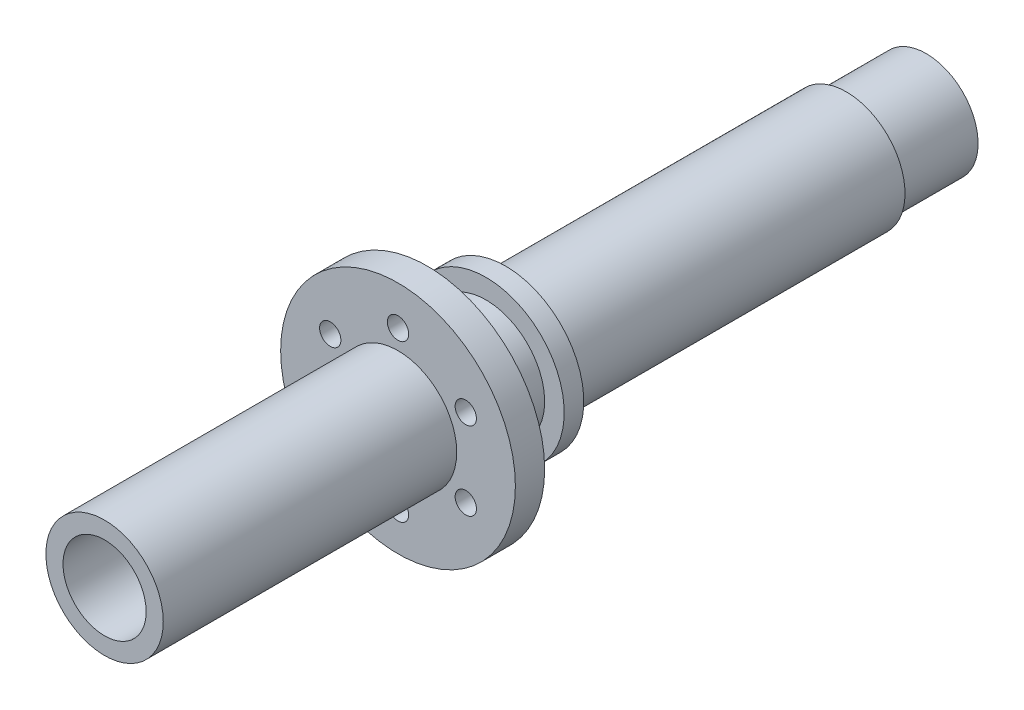
ISO-10303-21;
HEADER;
FILE_DESCRIPTION(('STEP AP214'),'2;1');
FILE_NAME('part.step','',(''),(''),'','','');
FILE_SCHEMA(('AUTOMOTIVE_DESIGN { 1 0 10303 214 1 1 1 1 }'));
ENDSEC;
DATA;
#1=APPLICATION_CONTEXT('core data for automotive mechanical design processes');
#2=APPLICATION_PROTOCOL_DEFINITION('international standard','automotive_design',2000,#1);
#3=PRODUCT_CONTEXT('',#1,'mechanical');
#4=PRODUCT('Part','Part','',(#3));
#5=PRODUCT_RELATED_PRODUCT_CATEGORY('part','',(#4));
#6=PRODUCT_DEFINITION_FORMATION('','',#4);
#7=PRODUCT_DEFINITION_CONTEXT('part definition',#1,'design');
#8=PRODUCT_DEFINITION('design','',#6,#7);
#9=PRODUCT_DEFINITION_SHAPE('','',#8);
#10=(LENGTH_UNIT() NAMED_UNIT(*) SI_UNIT(.MILLI.,.METRE.));
#11=(NAMED_UNIT(*) PLANE_ANGLE_UNIT() SI_UNIT($,.RADIAN.));
#12=(NAMED_UNIT(*) SI_UNIT($,.STERADIAN.) SOLID_ANGLE_UNIT());
#13=UNCERTAINTY_MEASURE_WITH_UNIT(LENGTH_MEASURE(1.E-05),#10,'distance_accuracy_value','');
#14=(GEOMETRIC_REPRESENTATION_CONTEXT(3) GLOBAL_UNCERTAINTY_ASSIGNED_CONTEXT((#13)) GLOBAL_UNIT_ASSIGNED_CONTEXT((#10,
#11,#12)) REPRESENTATION_CONTEXT('',''));
#15=CARTESIAN_POINT('',(0.,0.,0.));
#16=DIRECTION('',(0.,0.,1.));
#17=DIRECTION('',(1.,0.,0.));
#18=AXIS2_PLACEMENT_3D('',#15,#16,#17);
#19=CARTESIAN_POINT('',(0.,0.,85.7123));
#20=DIRECTION('',(0.,0.,1.));
#21=DIRECTION('',(1.,0.,0.));
#22=AXIS2_PLACEMENT_3D('',#19,#20,#21);
#23=PLANE('',#22);
#24=CARTESIAN_POINT('',(0.,0.,85.7123));
#25=DIRECTION('',(0.,0.,1.));
#26=DIRECTION('',(1.,0.,0.));
#27=AXIS2_PLACEMENT_3D('',#24,#25,#26);
#28=CIRCLE('',#27,19.05);
#29=CARTESIAN_POINT('',(19.05,0.,85.7123));
#30=VERTEX_POINT('',#29);
#31=EDGE_CURVE('E306',#30,#30,#28,.T.);
#32=ORIENTED_EDGE('',*,*,#31,.T.);
#33=EDGE_LOOP('',(#32));
#34=FACE_BOUND('',#33,.T.);
#35=CARTESIAN_POINT('',(10.9985226280623,6.34999999999981,85.7123));
#36=DIRECTION('',(0.,0.,1.));
#37=DIRECTION('',(1.,0.,0.));
#38=AXIS2_PLACEMENT_3D('',#35,#36,#37);
#39=CIRCLE('',#38,1.7272);
#40=CARTESIAN_POINT('',(12.7257226280623,6.34999999999981,85.7123));
#41=VERTEX_POINT('',#40);
#42=EDGE_CURVE('E289',#41,#41,#39,.T.);
#43=ORIENTED_EDGE('',*,*,#42,.F.);
#44=EDGE_LOOP('',(#43));
#45=FACE_BOUND('',#44,.T.);
#46=CARTESIAN_POINT('',(10.998522628062,-6.3500000000002,85.7123));
#47=DIRECTION('',(0.,0.,1.));
#48=DIRECTION('',(1.,0.,0.));
#49=AXIS2_PLACEMENT_3D('',#46,#47,#48);
#50=CIRCLE('',#49,1.7272);
#51=CARTESIAN_POINT('',(12.725722628062,-6.3500000000002,85.7123));
#52=VERTEX_POINT('',#51);
#53=EDGE_CURVE('E283',#52,#52,#50,.T.);
#54=ORIENTED_EDGE('',*,*,#53,.F.);
#55=EDGE_LOOP('',(#54));
#56=FACE_BOUND('',#55,.T.);
#57=CARTESIAN_POINT('',(-4.46917750882502E-13,-12.7,85.7123));
#58=DIRECTION('',(0.,0.,1.));
#59=DIRECTION('',(1.,0.,0.));
#60=AXIS2_PLACEMENT_3D('',#57,#58,#59);
#61=CIRCLE('',#60,1.7272);
#62=CARTESIAN_POINT('',(1.72719999999955,-12.7,85.7123));
#63=VERTEX_POINT('',#62);
#64=EDGE_CURVE('E277',#63,#63,#61,.T.);
#65=ORIENTED_EDGE('',*,*,#64,.F.);
#66=EDGE_LOOP('',(#65));
#67=FACE_BOUND('',#66,.T.);
#68=CARTESIAN_POINT('',(-10.9985226280627,-6.34999999999981,85.7123));
#69=DIRECTION('',(0.,0.,1.));
#70=DIRECTION('',(1.,0.,0.));
#71=AXIS2_PLACEMENT_3D('',#68,#69,#70);
#72=CIRCLE('',#71,1.7272);
#73=CARTESIAN_POINT('',(-9.27132262806271,-6.34999999999981,85.7123));
#74=VERTEX_POINT('',#73);
#75=EDGE_CURVE('E271',#74,#74,#72,.T.);
#76=ORIENTED_EDGE('',*,*,#75,.F.);
#77=EDGE_LOOP('',(#76));
#78=FACE_BOUND('',#77,.T.);
#79=CARTESIAN_POINT('',(-10.9985226280624,6.34999999999997,85.7123));
#80=DIRECTION('',(0.,0.,1.));
#81=DIRECTION('',(1.,0.,0.));
#82=AXIS2_PLACEMENT_3D('',#79,#80,#81);
#83=CIRCLE('',#82,1.7272);
#84=CARTESIAN_POINT('',(-9.27132262806239,6.34999999999997,85.7123));
#85=VERTEX_POINT('',#84);
#86=EDGE_CURVE('E265',#85,#85,#83,.T.);
#87=ORIENTED_EDGE('',*,*,#86,.F.);
#88=EDGE_LOOP('',(#87));
#89=FACE_BOUND('',#88,.T.);
#90=CARTESIAN_POINT('',(0.,12.7,85.7123));
#91=DIRECTION('',(0.,0.,1.));
#92=DIRECTION('',(1.,0.,0.));
#93=AXIS2_PLACEMENT_3D('',#90,#91,#92);
#94=CIRCLE('',#93,1.7272);
#95=CARTESIAN_POINT('',(1.7272,12.7,85.7123));
#96=VERTEX_POINT('',#95);
#97=EDGE_CURVE('E259',#96,#96,#94,.T.);
#98=ORIENTED_EDGE('',*,*,#97,.F.);
#99=EDGE_LOOP('',(#98));
#100=FACE_BOUND('',#99,.T.);
#101=CARTESIAN_POINT('',(0.,0.,85.7123));
#102=DIRECTION('',(0.,0.,1.));
#103=DIRECTION('',(1.,0.,0.));
#104=AXIS2_PLACEMENT_3D('',#101,#102,#103);
#105=CIRCLE('',#104,9.525);
#106=CARTESIAN_POINT('',(9.525,0.,85.7123));
#107=VERTEX_POINT('',#106);
#108=EDGE_CURVE('E254',#107,#107,#105,.T.);
#109=ORIENTED_EDGE('',*,*,#108,.F.);
#110=EDGE_LOOP('',(#109));
#111=FACE_BOUND('',#110,.T.);
#112=ADVANCED_FACE('F39',(#34,#45,#56,#67,#78,#89,#100,#111),#23,.T.);
#113=CARTESIAN_POINT('',(0.,0.,80.9625));
#114=DIRECTION('',(0.,0.,-1.));
#115=DIRECTION('',(-1.,0.,0.));
#116=AXIS2_PLACEMENT_3D('',#113,#114,#115);
#117=CYLINDRICAL_SURFACE('',#116,9.525);
#118=CARTESIAN_POINT('',(0.,0.,68.2625));
#119=DIRECTION('',(0.,0.,-1.));
#120=DIRECTION('',(-1.,0.,0.));
#121=AXIS2_PLACEMENT_3D('',#118,#119,#120);
#122=CIRCLE('',#121,9.525);
#123=CARTESIAN_POINT('',(-9.525,0.,68.2625));
#124=VERTEX_POINT('',#123);
#125=EDGE_CURVE('E296',#124,#124,#122,.T.);
#126=ORIENTED_EDGE('',*,*,#125,.T.);
#127=EDGE_LOOP('',(#126));
#128=FACE_BOUND('',#127,.T.);
#129=CARTESIAN_POINT('',(0.,0.,12.954));
#130=DIRECTION('',(0.,0.,-1.));
#131=DIRECTION('',(-1.,0.,0.));
#132=AXIS2_PLACEMENT_3D('',#129,#130,#131);
#133=CIRCLE('',#132,9.525);
#134=CARTESIAN_POINT('',(-9.525,0.,12.954));
#135=VERTEX_POINT('',#134);
#136=EDGE_CURVE('E302',#135,#135,#133,.T.);
#137=ORIENTED_EDGE('',*,*,#136,.F.);
#138=EDGE_LOOP('',(#137));
#139=FACE_BOUND('',#138,.T.);
#140=ADVANCED_FACE('F339',(#128,#139),#117,.T.);
#141=CARTESIAN_POINT('',(0.,0.,12.954));
#142=DIRECTION('',(0.,0.,-1.));
#143=DIRECTION('',(-1.,0.,0.));
#144=AXIS2_PLACEMENT_3D('',#141,#142,#143);
#145=PLANE('',#144);
#146=CARTESIAN_POINT('',(0.,0.,12.954));
#147=DIRECTION('',(0.,0.,-1.));
#148=DIRECTION('',(-1.,0.,0.));
#149=AXIS2_PLACEMENT_3D('',#146,#147,#148);
#150=CIRCLE('',#149,8.4328);
#151=CARTESIAN_POINT('',(-8.4328,0.,12.954));
#152=VERTEX_POINT('',#151);
#153=EDGE_CURVE('E299',#152,#152,#150,.T.);
#154=ORIENTED_EDGE('',*,*,#153,.F.);
#155=EDGE_LOOP('',(#154));
#156=FACE_BOUND('',#155,.T.);
#157=ORIENTED_EDGE('',*,*,#136,.T.);
#158=EDGE_LOOP('',(#157));
#159=FACE_BOUND('',#158,.T.);
#160=ADVANCED_FACE('F345',(#156,#159),#145,.T.);
#161=CARTESIAN_POINT('',(0.,0.,12.954));
#162=DIRECTION('',(0.,0.,-1.));
#163=DIRECTION('',(-1.,0.,0.));
#164=AXIS2_PLACEMENT_3D('',#161,#162,#163);
#165=CYLINDRICAL_SURFACE('',#164,8.4328);
#166=ORIENTED_EDGE('',*,*,#153,.T.);
#167=EDGE_LOOP('',(#166));
#168=FACE_BOUND('',#167,.T.);
#169=CARTESIAN_POINT('',(0.,0.,0.));
#170=DIRECTION('',(0.,0.,-1.));
#171=DIRECTION('',(-1.,0.,0.));
#172=AXIS2_PLACEMENT_3D('',#169,#170,#171);
#173=CIRCLE('',#172,8.4328);
#174=CARTESIAN_POINT('',(-8.4328,0.,0.));
#175=VERTEX_POINT('',#174);
#176=EDGE_CURVE('E303',#175,#175,#173,.T.);
#177=ORIENTED_EDGE('',*,*,#176,.F.);
#178=EDGE_LOOP('',(#177));
#179=FACE_BOUND('',#178,.T.);
#180=ADVANCED_FACE('F365',(#168,#179),#165,.T.);
#181=CARTESIAN_POINT('',(0.,0.,0.));
#182=DIRECTION('',(0.,0.,1.));
#183=DIRECTION('',(1.,0.,0.));
#184=AXIS2_PLACEMENT_3D('',#181,#182,#183);
#185=PLANE('',#184);
#186=CARTESIAN_POINT('',(1.54353941065862,-6.97500180288462,0.));
#187=DIRECTION('',(0.,0.,1.));
#188=DIRECTION('',(1.,0.,0.));
#189=AXIS2_PLACEMENT_3D('',#186,#187,#188);
#190=CIRCLE('',#189,0.539750000000001);
#191=CARTESIAN_POINT('',(1.01873601103469,-6.84886118990385,0.));
#192=VERTEX_POINT('',#191);
#193=CARTESIAN_POINT('',(1.42691643296441,-6.44800166666667,0.));
#194=VERTEX_POINT('',#193);
#195=EDGE_CURVE('E198',#192,#194,#190,.F.);
#196=ORIENTED_EDGE('',*,*,#195,.T.);
#197=CARTESIAN_POINT('',(0.,0.,0.));
#198=DIRECTION('',(0.,0.,1.));
#199=DIRECTION('',(1.,0.,0.));
#200=AXIS2_PLACEMENT_3D('',#197,#198,#199);
#201=CIRCLE('',#200,6.604);
#202=CARTESIAN_POINT('',(1.42691643296441,6.44800166666666,0.));
#203=VERTEX_POINT('',#202);
#204=EDGE_CURVE('E200',#194,#203,#201,.T.);
#205=ORIENTED_EDGE('',*,*,#204,.T.);
#206=CARTESIAN_POINT('',(1.54353941065862,6.97500180288461,0.));
#207=DIRECTION('',(0.,0.,1.));
#208=DIRECTION('',(1.,0.,0.));
#209=AXIS2_PLACEMENT_3D('',#206,#207,#208);
#210=CIRCLE('',#209,0.539750000000001);
#211=CARTESIAN_POINT('',(1.01873601103469,6.84886118990385,0.));
#212=VERTEX_POINT('',#211);
#213=EDGE_CURVE('E196',#203,#212,#210,.F.);
#214=ORIENTED_EDGE('',*,*,#213,.T.);
#215=CARTESIAN_POINT('',(0.,6.604,0.));
#216=DIRECTION('',(0.,0.,1.));
#217=DIRECTION('',(1.,0.,0.));
#218=AXIS2_PLACEMENT_3D('',#215,#216,#217);
#219=CIRCLE('',#218,1.04775);
#220=CARTESIAN_POINT('',(-1.01873601103468,6.84886118990385,0.));
#221=VERTEX_POINT('',#220);
#222=EDGE_CURVE('E192',#212,#221,#219,.T.);
#223=ORIENTED_EDGE('',*,*,#222,.T.);
#224=CARTESIAN_POINT('',(-1.54353941065861,6.97500180288462,0.));
#225=DIRECTION('',(0.,0.,1.));
#226=DIRECTION('',(1.,0.,0.));
#227=AXIS2_PLACEMENT_3D('',#224,#225,#226);
#228=CIRCLE('',#227,0.539750000000001);
#229=CARTESIAN_POINT('',(-1.42691643296441,6.44800166666667,0.));
#230=VERTEX_POINT('',#229);
#231=EDGE_CURVE('E188',#221,#230,#228,.F.);
#232=ORIENTED_EDGE('',*,*,#231,.T.);
#233=CARTESIAN_POINT('',(0.,0.,0.));
#234=DIRECTION('',(0.,0.,1.));
#235=DIRECTION('',(1.,0.,0.));
#236=AXIS2_PLACEMENT_3D('',#233,#234,#235);
#237=CIRCLE('',#236,6.604);
#238=CARTESIAN_POINT('',(-1.42691643296441,-6.44800166666667,0.));
#239=VERTEX_POINT('',#238);
#240=EDGE_CURVE('E186',#230,#239,#237,.T.);
#241=ORIENTED_EDGE('',*,*,#240,.T.);
#242=CARTESIAN_POINT('',(-1.54353941065862,-6.97500180288462,0.));
#243=DIRECTION('',(0.,0.,1.));
#244=DIRECTION('',(1.,0.,0.));
#245=AXIS2_PLACEMENT_3D('',#242,#243,#244);
#246=CIRCLE('',#245,0.539750000000001);
#247=CARTESIAN_POINT('',(-1.01873601103468,-6.84886118990385,0.));
#248=VERTEX_POINT('',#247);
#249=EDGE_CURVE('E190',#239,#248,#246,.F.);
#250=ORIENTED_EDGE('',*,*,#249,.T.);
#251=CARTESIAN_POINT('',(0.,-6.604,0.));
#252=DIRECTION('',(0.,0.,1.));
#253=DIRECTION('',(1.,0.,0.));
#254=AXIS2_PLACEMENT_3D('',#251,#252,#253);
#255=CIRCLE('',#254,1.04775);
#256=EDGE_CURVE('E194',#248,#192,#255,.T.);
#257=ORIENTED_EDGE('',*,*,#256,.T.);
#258=EDGE_LOOP('',(#196,#205,#214,#223,#232,#241,#250,#257));
#259=FACE_BOUND('',#258,.T.);
#260=ORIENTED_EDGE('',*,*,#176,.T.);
#261=EDGE_LOOP('',(#260));
#262=FACE_BOUND('',#261,.T.);
#263=ADVANCED_FACE('F362',(#259,#262),#185,.F.);
#264=CARTESIAN_POINT('',(0.,0.,68.2625));
#265=DIRECTION('',(0.,0.,-1.));
#266=DIRECTION('',(-1.,0.,0.));
#267=AXIS2_PLACEMENT_3D('',#264,#265,#266);
#268=PLANE('',#267);
#269=CARTESIAN_POINT('',(0.,0.,68.2625));
#270=DIRECTION('',(0.,0.,-1.));
#271=DIRECTION('',(-1.,0.,0.));
#272=AXIS2_PLACEMENT_3D('',#269,#270,#271);
#273=CIRCLE('',#272,12.7);
#274=CARTESIAN_POINT('',(-12.7,0.,68.2625));
#275=VERTEX_POINT('',#274);
#276=EDGE_CURVE('E293',#275,#275,#273,.T.);
#277=ORIENTED_EDGE('',*,*,#276,.T.);
#278=EDGE_LOOP('',(#277));
#279=FACE_BOUND('',#278,.T.);
#280=ORIENTED_EDGE('',*,*,#125,.F.);
#281=EDGE_LOOP('',(#280));
#282=FACE_BOUND('',#281,.T.);
#283=ADVANCED_FACE('F364',(#279,#282),#268,.T.);
#284=CARTESIAN_POINT('',(0.,0.,71.4375));
#285=DIRECTION('',(0.,0.,-1.));
#286=DIRECTION('',(-1.,0.,0.));
#287=AXIS2_PLACEMENT_3D('',#284,#285,#286);
#288=PLANE('',#287);
#289=CARTESIAN_POINT('',(0.,0.,71.4375));
#290=DIRECTION('',(0.,0.,-1.));
#291=DIRECTION('',(-1.,0.,0.));
#292=AXIS2_PLACEMENT_3D('',#289,#290,#291);
#293=CIRCLE('',#292,12.7);
#294=CARTESIAN_POINT('',(-12.7,0.,71.4375));
#295=VERTEX_POINT('',#294);
#296=EDGE_CURVE('E292',#295,#295,#293,.T.);
#297=ORIENTED_EDGE('',*,*,#296,.F.);
#298=EDGE_LOOP('',(#297));
#299=FACE_BOUND('',#298,.T.);
#300=CARTESIAN_POINT('',(0.,0.,71.4375));
#301=DIRECTION('',(0.,0.,-1.));
#302=DIRECTION('',(-1.,0.,0.));
#303=AXIS2_PLACEMENT_3D('',#300,#301,#302);
#304=CIRCLE('',#303,9.525);
#305=CARTESIAN_POINT('',(-9.525,0.,71.4375));
#306=VERTEX_POINT('',#305);
#307=EDGE_CURVE('E143',#306,#306,#304,.T.);
#308=ORIENTED_EDGE('',*,*,#307,.T.);
#309=EDGE_LOOP('',(#308));
#310=FACE_BOUND('',#309,.T.);
#311=ADVANCED_FACE('F652',(#299,#310),#288,.F.);
#312=CARTESIAN_POINT('',(0.,0.,68.2625));
#313=DIRECTION('',(0.,0.,1.));
#314=DIRECTION('',(1.,0.,0.));
#315=AXIS2_PLACEMENT_3D('',#312,#313,#314);
#316=CYLINDRICAL_SURFACE('',#315,12.7);
#317=ORIENTED_EDGE('',*,*,#276,.F.);
#318=EDGE_LOOP('',(#317));
#319=FACE_BOUND('',#318,.T.);
#320=ORIENTED_EDGE('',*,*,#296,.T.);
#321=EDGE_LOOP('',(#320));
#322=FACE_BOUND('',#321,.T.);
#323=ADVANCED_FACE('F360',(#319,#322),#316,.T.);
#324=CARTESIAN_POINT('',(0.,0.,85.7123));
#325=DIRECTION('',(0.,0.,-1.));
#326=DIRECTION('',(-1.,0.,0.));
#327=AXIS2_PLACEMENT_3D('',#324,#325,#326);
#328=CYLINDRICAL_SURFACE('',#327,19.05);
#329=ORIENTED_EDGE('',*,*,#31,.F.);
#330=EDGE_LOOP('',(#329));
#331=FACE_BOUND('',#330,.T.);
#332=CARTESIAN_POINT('',(0.,0.,80.9625));
#333=DIRECTION('',(0.,0.,1.));
#334=DIRECTION('',(1.,0.,0.));
#335=AXIS2_PLACEMENT_3D('',#332,#333,#334);
#336=CIRCLE('',#335,19.05);
#337=CARTESIAN_POINT('',(19.05,0.,80.9625));
#338=VERTEX_POINT('',#337);
#339=EDGE_CURVE('E310',#338,#338,#336,.T.);
#340=ORIENTED_EDGE('',*,*,#339,.T.);
#341=EDGE_LOOP('',(#340));
#342=FACE_BOUND('',#341,.T.);
#343=ADVANCED_FACE('F356',(#331,#342),#328,.T.);
#344=CARTESIAN_POINT('',(0.,0.,80.9625));
#345=DIRECTION('',(0.,0.,1.));
#346=DIRECTION('',(1.,0.,0.));
#347=AXIS2_PLACEMENT_3D('',#344,#345,#346);
#348=PLANE('',#347);
#349=CARTESIAN_POINT('',(0.,12.7,80.9625));
#350=DIRECTION('',(0.,0.,-1.));
#351=DIRECTION('',(-1.,0.,0.));
#352=AXIS2_PLACEMENT_3D('',#349,#350,#351);
#353=CIRCLE('',#352,1.7272);
#354=CARTESIAN_POINT('',(-1.7272,12.7,80.9625));
#355=VERTEX_POINT('',#354);
#356=EDGE_CURVE('E253',#355,#355,#353,.T.);
#357=ORIENTED_EDGE('',*,*,#356,.F.);
#358=EDGE_LOOP('',(#357));
#359=FACE_BOUND('',#358,.T.);
#360=CARTESIAN_POINT('',(-10.9985226280624,6.34999999999997,80.9625));
#361=DIRECTION('',(0.,0.,-1.));
#362=DIRECTION('',(-1.,0.,0.));
#363=AXIS2_PLACEMENT_3D('',#360,#361,#362);
#364=CIRCLE('',#363,1.7272);
#365=CARTESIAN_POINT('',(-12.7257226280624,6.34999999999997,80.9625));
#366=VERTEX_POINT('',#365);
#367=EDGE_CURVE('E262',#366,#366,#364,.T.);
#368=ORIENTED_EDGE('',*,*,#367,.F.);
#369=EDGE_LOOP('',(#368));
#370=FACE_BOUND('',#369,.T.);
#371=CARTESIAN_POINT('',(-10.9985226280627,-6.34999999999981,80.9625));
#372=DIRECTION('',(0.,0.,-1.));
#373=DIRECTION('',(-1.,0.,0.));
#374=AXIS2_PLACEMENT_3D('',#371,#372,#373);
#375=CIRCLE('',#374,1.7272);
#376=CARTESIAN_POINT('',(-12.7257226280627,-6.34999999999981,80.9625));
#377=VERTEX_POINT('',#376);
#378=EDGE_CURVE('E268',#377,#377,#375,.T.);
#379=ORIENTED_EDGE('',*,*,#378,.F.);
#380=EDGE_LOOP('',(#379));
#381=FACE_BOUND('',#380,.T.);
#382=CARTESIAN_POINT('',(-4.46917750882502E-13,-12.7,80.9625));
#383=DIRECTION('',(0.,0.,-1.));
#384=DIRECTION('',(-1.,0.,0.));
#385=AXIS2_PLACEMENT_3D('',#382,#383,#384);
#386=CIRCLE('',#385,1.7272);
#387=CARTESIAN_POINT('',(-1.72720000000045,-12.7,80.9625));
#388=VERTEX_POINT('',#387);
#389=EDGE_CURVE('E274',#388,#388,#386,.T.);
#390=ORIENTED_EDGE('',*,*,#389,.F.);
#391=EDGE_LOOP('',(#390));
#392=FACE_BOUND('',#391,.T.);
#393=CARTESIAN_POINT('',(10.998522628062,-6.3500000000002,80.9625));
#394=DIRECTION('',(0.,0.,-1.));
#395=DIRECTION('',(-1.,0.,0.));
#396=AXIS2_PLACEMENT_3D('',#393,#394,#395);
#397=CIRCLE('',#396,1.7272);
#398=CARTESIAN_POINT('',(9.27132262806203,-6.3500000000002,80.9625));
#399=VERTEX_POINT('',#398);
#400=EDGE_CURVE('E280',#399,#399,#397,.T.);
#401=ORIENTED_EDGE('',*,*,#400,.F.);
#402=EDGE_LOOP('',(#401));
#403=FACE_BOUND('',#402,.T.);
#404=CARTESIAN_POINT('',(10.9985226280623,6.34999999999981,80.9625));
#405=DIRECTION('',(0.,0.,-1.));
#406=DIRECTION('',(-1.,0.,0.));
#407=AXIS2_PLACEMENT_3D('',#404,#405,#406);
#408=CIRCLE('',#407,1.7272);
#409=CARTESIAN_POINT('',(9.27132262806226,6.34999999999981,80.9625));
#410=VERTEX_POINT('',#409);
#411=EDGE_CURVE('E286',#410,#410,#408,.T.);
#412=ORIENTED_EDGE('',*,*,#411,.F.);
#413=EDGE_LOOP('',(#412));
#414=FACE_BOUND('',#413,.T.);
#415=ORIENTED_EDGE('',*,*,#339,.F.);
#416=EDGE_LOOP('',(#415));
#417=FACE_BOUND('',#416,.T.);
#418=CARTESIAN_POINT('',(0.,0.,80.9625));
#419=DIRECTION('',(0.,0.,1.));
#420=DIRECTION('',(1.,0.,0.));
#421=AXIS2_PLACEMENT_3D('',#418,#419,#420);
#422=CIRCLE('',#421,9.525);
#423=CARTESIAN_POINT('',(9.525,0.,80.9625));
#424=VERTEX_POINT('',#423);
#425=EDGE_CURVE('E309',#424,#424,#422,.T.);
#426=ORIENTED_EDGE('',*,*,#425,.T.);
#427=EDGE_LOOP('',(#426));
#428=FACE_BOUND('',#427,.T.);
#429=ADVANCED_FACE('F353',(#359,#370,#381,#392,#403,#414,#417,#428),#348,.F.);
#430=ORIENTED_EDGE('',*,*,#425,.F.);
#431=EDGE_LOOP('',(#430));
#432=FACE_BOUND('',#431,.T.);
#433=ORIENTED_EDGE('',*,*,#307,.F.);
#434=EDGE_LOOP('',(#433));
#435=FACE_BOUND('',#434,.T.);
#436=ADVANCED_FACE('F348',(#432,#435),#117,.T.);
#437=CARTESIAN_POINT('',(10.9985226280623,6.34999999999981,80.9625));
#438=DIRECTION('',(0.,0.,-1.));
#439=DIRECTION('',(-1.,0.,0.));
#440=AXIS2_PLACEMENT_3D('',#437,#438,#439);
#441=CYLINDRICAL_SURFACE('',#440,1.7272);
#442=ORIENTED_EDGE('',*,*,#42,.T.);
#443=EDGE_LOOP('',(#442));
#444=FACE_BOUND('',#443,.T.);
#445=ORIENTED_EDGE('',*,*,#411,.T.);
#446=EDGE_LOOP('',(#445));
#447=FACE_BOUND('',#446,.T.);
#448=ADVANCED_FACE('F616',(#444,#447),#441,.F.);
#449=CARTESIAN_POINT('',(10.998522628062,-6.3500000000002,80.9625));
#450=DIRECTION('',(0.,0.,-1.));
#451=DIRECTION('',(-1.,0.,0.));
#452=AXIS2_PLACEMENT_3D('',#449,#450,#451);
#453=CYLINDRICAL_SURFACE('',#452,1.7272);
#454=ORIENTED_EDGE('',*,*,#53,.T.);
#455=EDGE_LOOP('',(#454));
#456=FACE_BOUND('',#455,.T.);
#457=ORIENTED_EDGE('',*,*,#400,.T.);
#458=EDGE_LOOP('',(#457));
#459=FACE_BOUND('',#458,.T.);
#460=ADVANCED_FACE('F606',(#456,#459),#453,.F.);
#461=CARTESIAN_POINT('',(-4.46917750882502E-13,-12.7,80.9625));
#462=DIRECTION('',(0.,0.,-1.));
#463=DIRECTION('',(-1.,0.,0.));
#464=AXIS2_PLACEMENT_3D('',#461,#462,#463);
#465=CYLINDRICAL_SURFACE('',#464,1.7272);
#466=ORIENTED_EDGE('',*,*,#64,.T.);
#467=EDGE_LOOP('',(#466));
#468=FACE_BOUND('',#467,.T.);
#469=ORIENTED_EDGE('',*,*,#389,.T.);
#470=EDGE_LOOP('',(#469));
#471=FACE_BOUND('',#470,.T.);
#472=ADVANCED_FACE('F596',(#468,#471),#465,.F.);
#473=CARTESIAN_POINT('',(-10.9985226280627,-6.34999999999981,80.9625));
#474=DIRECTION('',(0.,0.,-1.));
#475=DIRECTION('',(-1.,0.,0.));
#476=AXIS2_PLACEMENT_3D('',#473,#474,#475);
#477=CYLINDRICAL_SURFACE('',#476,1.7272);
#478=ORIENTED_EDGE('',*,*,#75,.T.);
#479=EDGE_LOOP('',(#478));
#480=FACE_BOUND('',#479,.T.);
#481=ORIENTED_EDGE('',*,*,#378,.T.);
#482=EDGE_LOOP('',(#481));
#483=FACE_BOUND('',#482,.T.);
#484=ADVANCED_FACE('F586',(#480,#483),#477,.F.);
#485=CARTESIAN_POINT('',(-10.9985226280624,6.34999999999997,80.9625));
#486=DIRECTION('',(0.,0.,-1.));
#487=DIRECTION('',(-1.,0.,0.));
#488=AXIS2_PLACEMENT_3D('',#485,#486,#487);
#489=CYLINDRICAL_SURFACE('',#488,1.7272);
#490=ORIENTED_EDGE('',*,*,#86,.T.);
#491=EDGE_LOOP('',(#490));
#492=FACE_BOUND('',#491,.T.);
#493=ORIENTED_EDGE('',*,*,#367,.T.);
#494=EDGE_LOOP('',(#493));
#495=FACE_BOUND('',#494,.T.);
#496=ADVANCED_FACE('F576',(#492,#495),#489,.F.);
#497=CARTESIAN_POINT('',(0.,12.7,80.9625));
#498=DIRECTION('',(0.,0.,-1.));
#499=DIRECTION('',(-1.,0.,0.));
#500=AXIS2_PLACEMENT_3D('',#497,#498,#499);
#501=CYLINDRICAL_SURFACE('',#500,1.7272);
#502=ORIENTED_EDGE('',*,*,#97,.T.);
#503=EDGE_LOOP('',(#502));
#504=FACE_BOUND('',#503,.T.);
#505=ORIENTED_EDGE('',*,*,#356,.T.);
#506=EDGE_LOOP('',(#505));
#507=FACE_BOUND('',#506,.T.);
#508=ADVANCED_FACE('F563',(#504,#507),#501,.F.);
#509=CARTESIAN_POINT('',(0.,0.,85.7123));
#510=DIRECTION('',(0.,0.,-1.));
#511=DIRECTION('',(-1.,0.,0.));
#512=AXIS2_PLACEMENT_3D('',#509,#510,#511);
#513=CYLINDRICAL_SURFACE('',#512,6.35);
#514=DIRECTION('',(0.,0.,-1.));
#515=VECTOR('',#514,1.);
#516=CARTESIAN_POINT('',(1.37203503169655,6.2000016025641,85.7123));
#517=LINE('',#516,#515);
#518=CARTESIAN_POINT('',(1.37203503169655,6.2000016025641,1.58750000000001));
#519=VERTEX_POINT('',#518);
#520=CARTESIAN_POINT('',(1.37203503169655,6.2000016025641,0.25399999999999));
#521=VERTEX_POINT('',#520);
#522=EDGE_CURVE('E137',#519,#521,#517,.T.);
#523=ORIENTED_EDGE('',*,*,#522,.T.);
#524=CARTESIAN_POINT('',(0.,0.,0.25399999999999));
#525=DIRECTION('',(0.,0.,1.));
#526=DIRECTION('',(1.,0.,0.));
#527=AXIS2_PLACEMENT_3D('',#524,#525,#526);
#528=CIRCLE('',#527,6.35);
#529=CARTESIAN_POINT('',(1.37203503169655,-6.2000016025641,0.25399999999999));
#530=VERTEX_POINT('',#529);
#531=EDGE_CURVE('E184',#521,#530,#528,.F.);
#532=ORIENTED_EDGE('',*,*,#531,.T.);
#533=DIRECTION('',(0.,0.,-1.));
#534=VECTOR('',#533,1.);
#535=CARTESIAN_POINT('',(1.37203503169655,-6.2000016025641,85.7123));
#536=LINE('',#535,#534);
#537=CARTESIAN_POINT('',(1.37203503169655,-6.2000016025641,1.58750000000001));
#538=VERTEX_POINT('',#537);
#539=EDGE_CURVE('E167',#530,#538,#536,.F.);
#540=ORIENTED_EDGE('',*,*,#539,.T.);
#541=CARTESIAN_POINT('',(0.,0.,1.58750000000001));
#542=DIRECTION('',(0.,0.,-1.));
#543=DIRECTION('',(-1.,0.,0.));
#544=AXIS2_PLACEMENT_3D('',#541,#542,#543);
#545=CIRCLE('',#544,6.35);
#546=CARTESIAN_POINT('',(-1.37203503169655,-6.2000016025641,1.58750000000001));
#547=VERTEX_POINT('',#546);
#548=EDGE_CURVE('E142',#547,#538,#545,.F.);
#549=ORIENTED_EDGE('',*,*,#548,.F.);
#550=DIRECTION('',(0.,0.,-1.));
#551=VECTOR('',#550,1.);
#552=CARTESIAN_POINT('',(-1.37203503169655,-6.2000016025641,85.7123));
#553=LINE('',#552,#551);
#554=CARTESIAN_POINT('',(-1.37203503169655,-6.2000016025641,0.25399999999999));
#555=VERTEX_POINT('',#554);
#556=EDGE_CURVE('E160',#547,#555,#553,.T.);
#557=ORIENTED_EDGE('',*,*,#556,.T.);
#558=CARTESIAN_POINT('',(0.,0.,0.25399999999999));
#559=DIRECTION('',(0.,0.,1.));
#560=DIRECTION('',(1.,0.,0.));
#561=AXIS2_PLACEMENT_3D('',#558,#559,#560);
#562=CIRCLE('',#561,6.35);
#563=CARTESIAN_POINT('',(-1.37203503169655,6.2000016025641,0.25399999999999));
#564=VERTEX_POINT('',#563);
#565=EDGE_CURVE('E153',#555,#564,#562,.F.);
#566=ORIENTED_EDGE('',*,*,#565,.T.);
#567=DIRECTION('',(0.,0.,-1.));
#568=VECTOR('',#567,1.);
#569=CARTESIAN_POINT('',(-1.37203503169655,6.2000016025641,85.7123));
#570=LINE('',#569,#568);
#571=CARTESIAN_POINT('',(-1.37203503169655,6.2000016025641,1.58750000000001));
#572=VERTEX_POINT('',#571);
#573=EDGE_CURVE('E139',#564,#572,#570,.F.);
#574=ORIENTED_EDGE('',*,*,#573,.T.);
#575=EDGE_CURVE('E131',#519,#572,#545,.F.);
#576=ORIENTED_EDGE('',*,*,#575,.F.);
#577=EDGE_LOOP('',(#523,#532,#540,#549,#557,#566,#574,#576));
#578=FACE_BOUND('',#577,.T.);
#579=CARTESIAN_POINT('',(0.,0.,107.699214988317));
#580=DIRECTION('',(0.,0.,1.));
#581=DIRECTION('',(1.,0.,0.));
#582=AXIS2_PLACEMENT_3D('',#579,#580,#581);
#583=CIRCLE('',#582,6.35);
#584=CARTESIAN_POINT('',(6.35,0.,107.699214988317));
#585=VERTEX_POINT('',#584);
#586=EDGE_CURVE('E249',#585,#585,#583,.T.);
#587=ORIENTED_EDGE('',*,*,#586,.T.);
#588=EDGE_LOOP('',(#587));
#589=FACE_BOUND('',#588,.T.);
#590=ADVANCED_FACE('F133',(#578,#589),#513,.F.);
#591=CARTESIAN_POINT('',(0.,0.,133.3373));
#592=DIRECTION('',(0.,0.,-1.));
#593=DIRECTION('',(-1.,0.,0.));
#594=AXIS2_PLACEMENT_3D('',#591,#592,#593);
#595=CYLINDRICAL_SURFACE('',#594,9.525);
#596=CARTESIAN_POINT('',(0.,0.,133.3373));
#597=DIRECTION('',(0.,0.,1.));
#598=DIRECTION('',(1.,0.,0.));
#599=AXIS2_PLACEMENT_3D('',#596,#597,#598);
#600=CIRCLE('',#599,9.525);
#601=CARTESIAN_POINT('',(9.525,0.,133.3373));
#602=VERTEX_POINT('',#601);
#603=EDGE_CURVE('E250',#602,#602,#600,.T.);
#604=ORIENTED_EDGE('',*,*,#603,.F.);
#605=EDGE_LOOP('',(#604));
#606=FACE_BOUND('',#605,.T.);
#607=ORIENTED_EDGE('',*,*,#108,.T.);
#608=EDGE_LOOP('',(#607));
#609=FACE_BOUND('',#608,.T.);
#610=ADVANCED_FACE('F335',(#606,#609),#595,.T.);
#611=CARTESIAN_POINT('',(0.,-42.0514213562373,133.3373));
#612=DIRECTION('',(0.,0.,1.));
#613=DIRECTION('',(1.,0.,0.));
#614=AXIS2_PLACEMENT_3D('',#611,#612,#613);
#615=PLANE('',#614);
#616=CARTESIAN_POINT('',(0.,0.,133.3373));
#617=DIRECTION('',(0.,0.,1.));
#618=DIRECTION('',(1.,0.,0.));
#619=AXIS2_PLACEMENT_3D('',#616,#617,#618);
#620=CIRCLE('',#619,6.74624);
#621=CARTESIAN_POINT('',(6.74624,0.,133.3373));
#622=VERTEX_POINT('',#621);
#623=EDGE_CURVE('E241',#622,#622,#620,.T.);
#624=ORIENTED_EDGE('',*,*,#623,.F.);
#625=EDGE_LOOP('',(#624));
#626=FACE_BOUND('',#625,.T.);
#627=ORIENTED_EDGE('',*,*,#603,.T.);
#628=EDGE_LOOP('',(#627));
#629=FACE_BOUND('',#628,.T.);
#630=ADVANCED_FACE('F326',(#626,#629),#615,.T.);
#631=CARTESIAN_POINT('',(0.,0.,107.9373));
#632=DIRECTION('',(0.,0.,1.));
#633=DIRECTION('',(1.,0.,0.));
#634=AXIS2_PLACEMENT_3D('',#631,#632,#633);
#635=CONICAL_SURFACE('',#634,6.74623999999999,1.02974425867665);
#636=CARTESIAN_POINT('',(0.,0.,107.9373));
#637=DIRECTION('',(0.,0.,1.));
#638=DIRECTION('',(1.,0.,0.));
#639=AXIS2_PLACEMENT_3D('',#636,#637,#638);
#640=CIRCLE('',#639,6.74623999999999);
#641=CARTESIAN_POINT('',(6.74623999999999,0.,107.9373));
#642=VERTEX_POINT('',#641);
#643=EDGE_CURVE('E246',#642,#642,#640,.T.);
#644=ORIENTED_EDGE('',*,*,#643,.T.);
#645=EDGE_LOOP('',(#644));
#646=FACE_BOUND('',#645,.T.);
#647=ORIENTED_EDGE('',*,*,#586,.F.);
#648=EDGE_LOOP('',(#647));
#649=FACE_BOUND('',#648,.T.);
#650=ADVANCED_FACE('F323',(#646,#649),#635,.F.);
#651=CARTESIAN_POINT('',(0.,0.,133.3373));
#652=DIRECTION('',(0.,0.,1.));
#653=DIRECTION('',(1.,0.,0.));
#654=AXIS2_PLACEMENT_3D('',#651,#652,#653);
#655=CYLINDRICAL_SURFACE('',#654,6.74624);
#656=ORIENTED_EDGE('',*,*,#643,.F.);
#657=EDGE_LOOP('',(#656));
#658=FACE_BOUND('',#657,.T.);
#659=ORIENTED_EDGE('',*,*,#623,.T.);
#660=EDGE_LOOP('',(#659));
#661=FACE_BOUND('',#660,.T.);
#662=ADVANCED_FACE('F325',(#658,#661),#655,.F.);
#663=CARTESIAN_POINT('',(0.,-6.604,1.5875));
#664=DIRECTION('',(0.,0.,-1.));
#665=DIRECTION('',(-1.,0.,0.));
#666=AXIS2_PLACEMENT_3D('',#663,#664,#665);
#667=PLANE('',#666);
#668=ORIENTED_EDGE('',*,*,#575,.T.);
#669=CARTESIAN_POINT('',(-1.54353941065861,6.97500180288462,1.5875));
#670=DIRECTION('',(0.,0.,-1.));
#671=DIRECTION('',(-1.,0.,0.));
#672=AXIS2_PLACEMENT_3D('',#669,#670,#671);
#673=CIRCLE('',#672,0.79375);
#674=CARTESIAN_POINT('',(-0.771769705329308,6.78950090144231,1.5875));
#675=VERTEX_POINT('',#674);
#676=EDGE_CURVE('E154',#572,#675,#673,.F.);
#677=ORIENTED_EDGE('',*,*,#676,.T.);
#678=CARTESIAN_POINT('',(0.,6.604,1.5875));
#679=DIRECTION('',(0.,0.,-1.));
#680=DIRECTION('',(-1.,0.,0.));
#681=AXIS2_PLACEMENT_3D('',#678,#679,#680);
#682=CIRCLE('',#681,0.79375);
#683=CARTESIAN_POINT('',(0.771769705329313,6.78950090144231,1.5875));
#684=VERTEX_POINT('',#683);
#685=EDGE_CURVE('E150',#675,#684,#682,.T.);
#686=ORIENTED_EDGE('',*,*,#685,.T.);
#687=CARTESIAN_POINT('',(1.54353941065862,6.97500180288461,1.5875));
#688=DIRECTION('',(0.,0.,-1.));
#689=DIRECTION('',(-1.,0.,0.));
#690=AXIS2_PLACEMENT_3D('',#687,#688,#689);
#691=CIRCLE('',#690,0.79375);
#692=EDGE_CURVE('E147',#684,#519,#691,.F.);
#693=ORIENTED_EDGE('',*,*,#692,.T.);
#694=EDGE_LOOP('',(#668,#677,#686,#693));
#695=FACE_BOUND('',#694,.T.);
#696=ADVANCED_FACE('F148',(#695),#667,.T.);
#697=CARTESIAN_POINT('',(0.,6.604,1.5875));
#698=DIRECTION('',(0.,0.,-1.));
#699=DIRECTION('',(-1.,0.,0.));
#700=AXIS2_PLACEMENT_3D('',#697,#698,#699);
#701=CYLINDRICAL_SURFACE('',#700,0.79375);
#702=DIRECTION('',(0.,0.,-1.));
#703=VECTOR('',#702,1.);
#704=CARTESIAN_POINT('',(-0.771769705329308,6.78950090144231,1.5875));
#705=LINE('',#704,#703);
#706=CARTESIAN_POINT('',(-0.771769705329308,6.78950090144231,0.253999999999992));
#707=VERTEX_POINT('',#706);
#708=EDGE_CURVE('E175',#675,#707,#705,.T.);
#709=ORIENTED_EDGE('',*,*,#708,.T.);
#710=CARTESIAN_POINT('',(0.,6.604,0.253999999999992));
#711=DIRECTION('',(0.,0.,1.));
#712=DIRECTION('',(1.,0.,0.));
#713=AXIS2_PLACEMENT_3D('',#710,#711,#712);
#714=CIRCLE('',#713,0.79375);
#715=CARTESIAN_POINT('',(0.771769705329313,6.78950090144231,0.253999999999992));
#716=VERTEX_POINT('',#715);
#717=EDGE_CURVE('E207',#707,#716,#714,.F.);
#718=ORIENTED_EDGE('',*,*,#717,.T.);
#719=DIRECTION('',(0.,0.,-1.));
#720=VECTOR('',#719,1.);
#721=CARTESIAN_POINT('',(0.771769705329313,6.78950090144231,1.5875));
#722=LINE('',#721,#720);
#723=EDGE_CURVE('E173',#716,#684,#722,.F.);
#724=ORIENTED_EDGE('',*,*,#723,.T.);
#725=ORIENTED_EDGE('',*,*,#685,.F.);
#726=EDGE_LOOP('',(#709,#718,#724,#725));
#727=FACE_BOUND('',#726,.T.);
#728=ADVANCED_FACE('F423',(#727),#701,.F.);
#729=ORIENTED_EDGE('',*,*,#548,.T.);
#730=CARTESIAN_POINT('',(1.54353941065862,-6.97500180288462,1.5875));
#731=DIRECTION('',(0.,0.,-1.));
#732=DIRECTION('',(-1.,0.,0.));
#733=AXIS2_PLACEMENT_3D('',#730,#731,#732);
#734=CIRCLE('',#733,0.79375);
#735=CARTESIAN_POINT('',(0.771769705329311,-6.78950090144231,1.5875));
#736=VERTEX_POINT('',#735);
#737=EDGE_CURVE('E177',#538,#736,#734,.F.);
#738=ORIENTED_EDGE('',*,*,#737,.T.);
#739=CARTESIAN_POINT('',(0.,-6.604,1.5875));
#740=DIRECTION('',(0.,0.,-1.));
#741=DIRECTION('',(-1.,0.,0.));
#742=AXIS2_PLACEMENT_3D('',#739,#740,#741);
#743=CIRCLE('',#742,0.79375);
#744=CARTESIAN_POINT('',(-0.771769705329311,-6.78950090144231,1.5875));
#745=VERTEX_POINT('',#744);
#746=EDGE_CURVE('E232',#736,#745,#743,.T.);
#747=ORIENTED_EDGE('',*,*,#746,.T.);
#748=CARTESIAN_POINT('',(-1.54353941065862,-6.97500180288462,1.5875));
#749=DIRECTION('',(0.,0.,-1.));
#750=DIRECTION('',(-1.,0.,0.));
#751=AXIS2_PLACEMENT_3D('',#748,#749,#750);
#752=CIRCLE('',#751,0.79375);
#753=EDGE_CURVE('E179',#745,#547,#752,.F.);
#754=ORIENTED_EDGE('',*,*,#753,.T.);
#755=EDGE_LOOP('',(#729,#738,#747,#754));
#756=FACE_BOUND('',#755,.T.);
#757=ADVANCED_FACE('F425',(#756),#667,.T.);
#758=CARTESIAN_POINT('',(0.,-6.604,1.5875));
#759=DIRECTION('',(0.,0.,-1.));
#760=DIRECTION('',(-1.,0.,0.));
#761=AXIS2_PLACEMENT_3D('',#758,#759,#760);
#762=CYLINDRICAL_SURFACE('',#761,0.79375);
#763=DIRECTION('',(0.,0.,-1.));
#764=VECTOR('',#763,1.);
#765=CARTESIAN_POINT('',(0.771769705329311,-6.78950090144231,1.5875));
#766=LINE('',#765,#764);
#767=CARTESIAN_POINT('',(0.771769705329311,-6.78950090144231,0.253999999999992));
#768=VERTEX_POINT('',#767);
#769=EDGE_CURVE('E171',#736,#768,#766,.T.);
#770=ORIENTED_EDGE('',*,*,#769,.T.);
#771=CARTESIAN_POINT('',(0.,-6.604,0.253999999999992));
#772=DIRECTION('',(0.,0.,1.));
#773=DIRECTION('',(1.,0.,0.));
#774=AXIS2_PLACEMENT_3D('',#771,#772,#773);
#775=CIRCLE('',#774,0.79375);
#776=CARTESIAN_POINT('',(-0.771769705329311,-6.78950090144231,0.253999999999992));
#777=VERTEX_POINT('',#776);
#778=EDGE_CURVE('E62',#768,#777,#775,.F.);
#779=ORIENTED_EDGE('',*,*,#778,.T.);
#780=DIRECTION('',(0.,0.,-1.));
#781=VECTOR('',#780,1.);
#782=CARTESIAN_POINT('',(-0.771769705329311,-6.78950090144231,1.5875));
#783=LINE('',#782,#781);
#784=EDGE_CURVE('E169',#777,#745,#783,.F.);
#785=ORIENTED_EDGE('',*,*,#784,.T.);
#786=ORIENTED_EDGE('',*,*,#746,.F.);
#787=EDGE_LOOP('',(#770,#779,#785,#786));
#788=FACE_BOUND('',#787,.T.);
#789=ADVANCED_FACE('F372',(#788),#762,.F.);
#790=CARTESIAN_POINT('',(1.54353941065862,-6.97500180288462,1.5875));
#791=DIRECTION('',(0.,0.,1.));
#792=DIRECTION('',(1.,0.,0.));
#793=AXIS2_PLACEMENT_3D('',#790,#791,#792);
#794=CYLINDRICAL_SURFACE('',#793,0.79375);
#795=ORIENTED_EDGE('',*,*,#539,.F.);
#796=CARTESIAN_POINT('',(1.54353941065862,-6.97500180288462,0.253999999999992));
#797=DIRECTION('',(0.,0.,1.));
#798=DIRECTION('',(1.,0.,0.));
#799=AXIS2_PLACEMENT_3D('',#796,#797,#798);
#800=CIRCLE('',#799,0.79375);
#801=EDGE_CURVE('E203',#530,#768,#800,.T.);
#802=ORIENTED_EDGE('',*,*,#801,.T.);
#803=ORIENTED_EDGE('',*,*,#769,.F.);
#804=ORIENTED_EDGE('',*,*,#737,.F.);
#805=EDGE_LOOP('',(#795,#802,#803,#804));
#806=FACE_BOUND('',#805,.T.);
#807=ADVANCED_FACE('F368',(#806),#794,.T.);
#808=CARTESIAN_POINT('',(-1.54353941065862,-6.97500180288462,1.5875));
#809=DIRECTION('',(0.,0.,-1.));
#810=DIRECTION('',(-1.,0.,0.));
#811=AXIS2_PLACEMENT_3D('',#808,#809,#810);
#812=CYLINDRICAL_SURFACE('',#811,0.79375);
#813=ORIENTED_EDGE('',*,*,#784,.F.);
#814=CARTESIAN_POINT('',(-1.54353941065862,-6.97500180288462,0.253999999999992));
#815=DIRECTION('',(0.,0.,1.));
#816=DIRECTION('',(1.,0.,0.));
#817=AXIS2_PLACEMENT_3D('',#814,#815,#816);
#818=CIRCLE('',#817,0.79375);
#819=EDGE_CURVE('E48',#777,#555,#818,.T.);
#820=ORIENTED_EDGE('',*,*,#819,.T.);
#821=ORIENTED_EDGE('',*,*,#556,.F.);
#822=ORIENTED_EDGE('',*,*,#753,.F.);
#823=EDGE_LOOP('',(#813,#820,#821,#822));
#824=FACE_BOUND('',#823,.T.);
#825=ADVANCED_FACE('F371',(#824),#812,.T.);
#826=CARTESIAN_POINT('',(-1.54353941065861,6.97500180288462,1.5875));
#827=DIRECTION('',(0.,0.,1.));
#828=DIRECTION('',(1.,0.,0.));
#829=AXIS2_PLACEMENT_3D('',#826,#827,#828);
#830=CYLINDRICAL_SURFACE('',#829,0.79375);
#831=ORIENTED_EDGE('',*,*,#573,.F.);
#832=CARTESIAN_POINT('',(-1.54353941065861,6.97500180288462,0.253999999999992));
#833=DIRECTION('',(0.,0.,1.));
#834=DIRECTION('',(1.,0.,0.));
#835=AXIS2_PLACEMENT_3D('',#832,#833,#834);
#836=CIRCLE('',#835,0.79375);
#837=EDGE_CURVE('E12',#564,#707,#836,.T.);
#838=ORIENTED_EDGE('',*,*,#837,.T.);
#839=ORIENTED_EDGE('',*,*,#708,.F.);
#840=ORIENTED_EDGE('',*,*,#676,.F.);
#841=EDGE_LOOP('',(#831,#838,#839,#840));
#842=FACE_BOUND('',#841,.T.);
#843=ADVANCED_FACE('F376',(#842),#830,.T.);
#844=CARTESIAN_POINT('',(1.54353941065862,6.97500180288461,1.5875));
#845=DIRECTION('',(0.,0.,-1.));
#846=DIRECTION('',(-1.,0.,0.));
#847=AXIS2_PLACEMENT_3D('',#844,#845,#846);
#848=CYLINDRICAL_SURFACE('',#847,0.79375);
#849=ORIENTED_EDGE('',*,*,#723,.F.);
#850=CARTESIAN_POINT('',(1.54353941065862,6.97500180288461,0.253999999999992));
#851=DIRECTION('',(0.,0.,1.));
#852=DIRECTION('',(1.,0.,0.));
#853=AXIS2_PLACEMENT_3D('',#850,#851,#852);
#854=CIRCLE('',#853,0.79375);
#855=EDGE_CURVE('E158',#716,#521,#854,.T.);
#856=ORIENTED_EDGE('',*,*,#855,.T.);
#857=ORIENTED_EDGE('',*,*,#522,.F.);
#858=ORIENTED_EDGE('',*,*,#692,.F.);
#859=EDGE_LOOP('',(#849,#856,#857,#858));
#860=FACE_BOUND('',#859,.T.);
#861=ADVANCED_FACE('F156',(#860),#848,.T.);
#862=CARTESIAN_POINT('',(0.,0.,0.25399999999999));
#863=DIRECTION('',(0.,0.,-1.));
#864=DIRECTION('',(-1.,0.,0.));
#865=AXIS2_PLACEMENT_3D('',#862,#863,#864);
#866=CONICAL_SURFACE('',#865,6.35,0.785398163397465);
#867=DIRECTION('',(0.152783507864274,0.690403649848916,0.707106781186535));
#868=VECTOR('',#867,1.);
#869=CARTESIAN_POINT('',(-1.42691643296441,-6.44800166666667,0.));
#870=LINE('',#869,#868);
#871=EDGE_CURVE('E225',#239,#555,#870,.T.);
#872=ORIENTED_EDGE('',*,*,#871,.F.);
#873=ORIENTED_EDGE('',*,*,#240,.F.);
#874=DIRECTION('',(-0.152783507864275,0.690403649848916,-0.707106781186535));
#875=VECTOR('',#874,1.);
#876=CARTESIAN_POINT('',(-1.37203503169655,6.2000016025641,0.25399999999999));
#877=LINE('',#876,#875);
#878=EDGE_CURVE('E43',#564,#230,#877,.T.);
#879=ORIENTED_EDGE('',*,*,#878,.F.);
#880=ORIENTED_EDGE('',*,*,#565,.F.);
#881=EDGE_LOOP('',(#872,#873,#879,#880));
#882=FACE_BOUND('',#881,.T.);
#883=ADVANCED_FACE('F41',(#882),#866,.F.);
#884=CARTESIAN_POINT('',(-1.54353941065861,6.97500180288462,0.));
#885=DIRECTION('',(0.,0.,1.));
#886=DIRECTION('',(1.,0.,0.));
#887=AXIS2_PLACEMENT_3D('',#884,#885,#886);
#888=CONICAL_SURFACE('',#887,0.539750000000001,0.785398163397462);
#889=ORIENTED_EDGE('',*,*,#878,.T.);
#890=ORIENTED_EDGE('',*,*,#231,.F.);
#891=DIRECTION('',(-0.687525785389236,0.165252214584034,-0.707106781186538));
#892=VECTOR('',#891,1.);
#893=CARTESIAN_POINT('',(-0.771769705329303,6.78950090144231,0.253999999999992));
#894=LINE('',#893,#892);
#895=EDGE_CURVE('E223',#707,#221,#894,.T.);
#896=ORIENTED_EDGE('',*,*,#895,.F.);
#897=ORIENTED_EDGE('',*,*,#837,.F.);
#898=EDGE_LOOP('',(#889,#890,#896,#897));
#899=FACE_BOUND('',#898,.T.);
#900=ADVANCED_FACE('F404',(#899),#888,.T.);
#901=CARTESIAN_POINT('',(-1.54353941065862,-6.97500180288462,0.));
#902=DIRECTION('',(0.,0.,1.));
#903=DIRECTION('',(1.,0.,0.));
#904=AXIS2_PLACEMENT_3D('',#901,#902,#903);
#905=CONICAL_SURFACE('',#904,0.539750000000001,0.785398163397462);
#906=ORIENTED_EDGE('',*,*,#871,.T.);
#907=ORIENTED_EDGE('',*,*,#819,.F.);
#908=DIRECTION('',(0.687525785389236,0.165252214584034,0.707106781186538));
#909=VECTOR('',#908,1.);
#910=CARTESIAN_POINT('',(-1.01873601103468,-6.84886118990385,0.));
#911=LINE('',#910,#909);
#912=EDGE_CURVE('E220',#248,#777,#911,.T.);
#913=ORIENTED_EDGE('',*,*,#912,.F.);
#914=ORIENTED_EDGE('',*,*,#249,.F.);
#915=EDGE_LOOP('',(#906,#907,#913,#914));
#916=FACE_BOUND('',#915,.T.);
#917=ADVANCED_FACE('F401',(#916),#905,.T.);
#918=CARTESIAN_POINT('',(0.,6.604,0.253999999999992));
#919=DIRECTION('',(0.,0.,-1.));
#920=DIRECTION('',(-1.,0.,0.));
#921=AXIS2_PLACEMENT_3D('',#918,#919,#920);
#922=CONICAL_SURFACE('',#921,0.79375,0.785398163397462);
#923=ORIENTED_EDGE('',*,*,#895,.T.);
#924=ORIENTED_EDGE('',*,*,#222,.F.);
#925=DIRECTION('',(0.687525785389237,0.165252214584031,-0.707106781186538));
#926=VECTOR('',#925,1.);
#927=CARTESIAN_POINT('',(0.771769705329313,6.78950090144231,0.253999999999992));
#928=LINE('',#927,#926);
#929=EDGE_CURVE('E217',#716,#212,#928,.T.);
#930=ORIENTED_EDGE('',*,*,#929,.F.);
#931=ORIENTED_EDGE('',*,*,#717,.F.);
#932=EDGE_LOOP('',(#923,#924,#930,#931));
#933=FACE_BOUND('',#932,.T.);
#934=ADVANCED_FACE('F397',(#933),#922,.F.);
#935=CARTESIAN_POINT('',(0.,-6.604,0.253999999999992));
#936=DIRECTION('',(0.,0.,-1.));
#937=DIRECTION('',(-1.,0.,0.));
#938=AXIS2_PLACEMENT_3D('',#935,#936,#937);
#939=CONICAL_SURFACE('',#938,0.79375,0.785398163397462);
#940=ORIENTED_EDGE('',*,*,#912,.T.);
#941=ORIENTED_EDGE('',*,*,#778,.F.);
#942=DIRECTION('',(-0.687525785389237,0.165252214584031,0.707106781186538));
#943=VECTOR('',#942,1.);
#944=CARTESIAN_POINT('',(1.01873601103469,-6.84886118990385,0.));
#945=LINE('',#944,#943);
#946=EDGE_CURVE('E214',#192,#768,#945,.T.);
#947=ORIENTED_EDGE('',*,*,#946,.F.);
#948=ORIENTED_EDGE('',*,*,#256,.F.);
#949=EDGE_LOOP('',(#940,#941,#947,#948));
#950=FACE_BOUND('',#949,.T.);
#951=ADVANCED_FACE('F393',(#950),#939,.F.);
#952=CARTESIAN_POINT('',(1.54353941065862,6.97500180288461,0.));
#953=DIRECTION('',(0.,0.,1.));
#954=DIRECTION('',(1.,0.,0.));
#955=AXIS2_PLACEMENT_3D('',#952,#953,#954);
#956=CONICAL_SURFACE('',#955,0.539750000000001,0.785398163397462);
#957=ORIENTED_EDGE('',*,*,#929,.T.);
#958=ORIENTED_EDGE('',*,*,#213,.F.);
#959=DIRECTION('',(0.152783507864274,0.690403649848914,-0.707106781186537));
#960=VECTOR('',#959,1.);
#961=CARTESIAN_POINT('',(1.37203503169655,6.2000016025641,0.253999999999992));
#962=LINE('',#961,#960);
#963=EDGE_CURVE('E212',#521,#203,#962,.T.);
#964=ORIENTED_EDGE('',*,*,#963,.F.);
#965=ORIENTED_EDGE('',*,*,#855,.F.);
#966=EDGE_LOOP('',(#957,#958,#964,#965));
#967=FACE_BOUND('',#966,.T.);
#968=ADVANCED_FACE('F389',(#967),#956,.T.);
#969=CARTESIAN_POINT('',(1.54353941065862,-6.97500180288462,0.));
#970=DIRECTION('',(0.,0.,1.));
#971=DIRECTION('',(1.,0.,0.));
#972=AXIS2_PLACEMENT_3D('',#969,#970,#971);
#973=CONICAL_SURFACE('',#972,0.539750000000001,0.785398163397462);
#974=ORIENTED_EDGE('',*,*,#946,.T.);
#975=ORIENTED_EDGE('',*,*,#801,.F.);
#976=DIRECTION('',(-0.152783507864274,0.690403649848914,0.707106781186537));
#977=VECTOR('',#976,1.);
#978=CARTESIAN_POINT('',(1.42691643296441,-6.44800166666667,0.));
#979=LINE('',#978,#977);
#980=EDGE_CURVE('E210',#194,#530,#979,.T.);
#981=ORIENTED_EDGE('',*,*,#980,.F.);
#982=ORIENTED_EDGE('',*,*,#195,.F.);
#983=EDGE_LOOP('',(#974,#975,#981,#982));
#984=FACE_BOUND('',#983,.T.);
#985=ADVANCED_FACE('F385',(#984),#973,.T.);
#986=CARTESIAN_POINT('',(0.,0.,0.25399999999999));
#987=DIRECTION('',(0.,0.,-1.));
#988=DIRECTION('',(-1.,0.,0.));
#989=AXIS2_PLACEMENT_3D('',#986,#987,#988);
#990=CONICAL_SURFACE('',#989,6.35,0.785398163397465);
#991=ORIENTED_EDGE('',*,*,#963,.T.);
#992=ORIENTED_EDGE('',*,*,#204,.F.);
#993=ORIENTED_EDGE('',*,*,#980,.T.);
#994=ORIENTED_EDGE('',*,*,#531,.F.);
#995=EDGE_LOOP('',(#991,#992,#993,#994));
#996=FACE_BOUND('',#995,.T.);
#997=ADVANCED_FACE('F382',(#996),#990,.F.);
#998=CLOSED_SHELL('',(#112,#140,#160,#180,#263,#283,#311,#323,#343,#429,#436,#448,#460,#472,
#484,#496,#508,#590,#610,#630,#650,#662,#696,#728,#757,#789,#807,#825,#843,#861,#883,#900,#917,
#934,#951,#968,#985,#997));
#999=MANIFOLD_SOLID_BREP('B2',#998);
#1000=ADVANCED_BREP_SHAPE_REPRESENTATION('',(#18,#999),#14);
#1001=SHAPE_DEFINITION_REPRESENTATION(#9,#1000);
ENDSEC;
END-ISO-10303-21;
